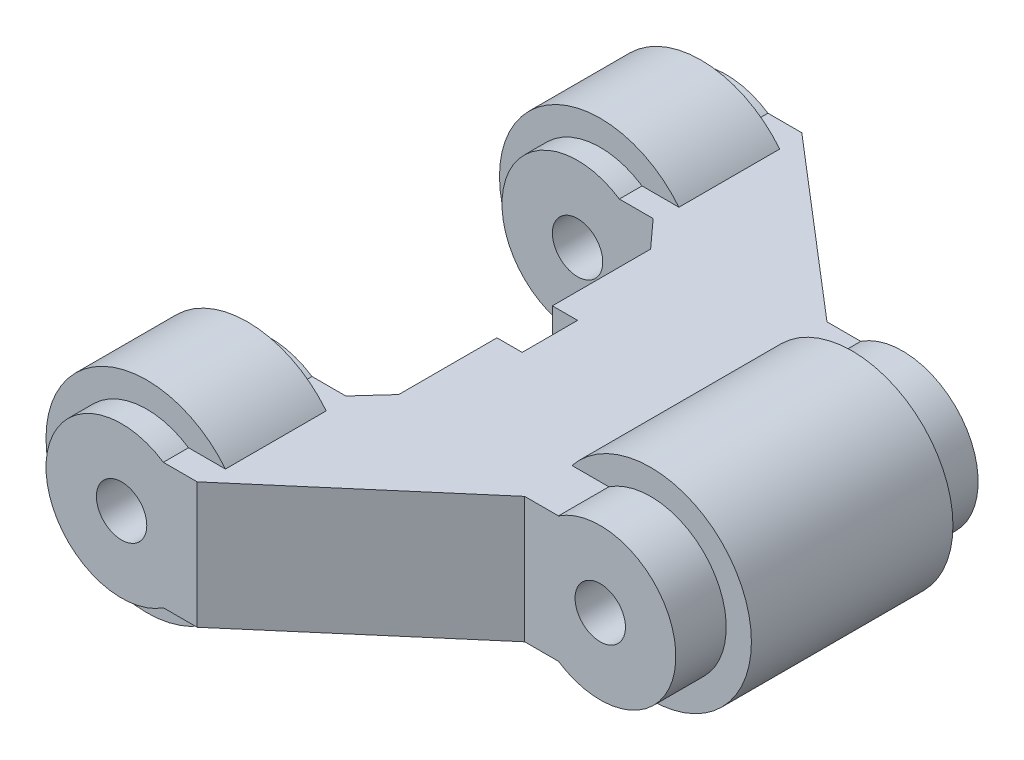
ISO-10303-21;
HEADER;
FILE_DESCRIPTION(('STEP AP214'),'2;1');
FILE_NAME('part.step','',(''),(''),'','','');
FILE_SCHEMA(('AUTOMOTIVE_DESIGN { 1 0 10303 214 1 1 1 1 }'));
ENDSEC;
DATA;
#1=APPLICATION_CONTEXT('core data for automotive mechanical design processes');
#2=APPLICATION_PROTOCOL_DEFINITION('international standard','automotive_design',2000,#1);
#3=PRODUCT_CONTEXT('',#1,'mechanical');
#4=PRODUCT('Part','Part','',(#3));
#5=PRODUCT_RELATED_PRODUCT_CATEGORY('part','',(#4));
#6=PRODUCT_DEFINITION_FORMATION('','',#4);
#7=PRODUCT_DEFINITION_CONTEXT('part definition',#1,'design');
#8=PRODUCT_DEFINITION('design','',#6,#7);
#9=PRODUCT_DEFINITION_SHAPE('','',#8);
#10=(LENGTH_UNIT() NAMED_UNIT(*) SI_UNIT(.MILLI.,.METRE.));
#11=(NAMED_UNIT(*) PLANE_ANGLE_UNIT() SI_UNIT($,.RADIAN.));
#12=(NAMED_UNIT(*) SI_UNIT($,.STERADIAN.) SOLID_ANGLE_UNIT());
#13=UNCERTAINTY_MEASURE_WITH_UNIT(LENGTH_MEASURE(1.E-05),#10,'distance_accuracy_value','');
#14=(GEOMETRIC_REPRESENTATION_CONTEXT(3) GLOBAL_UNCERTAINTY_ASSIGNED_CONTEXT((#13)) GLOBAL_UNIT_ASSIGNED_CONTEXT((#10,
#11,#12)) REPRESENTATION_CONTEXT('',''));
#15=CARTESIAN_POINT('',(0.,0.,0.));
#16=DIRECTION('',(0.,0.,1.));
#17=DIRECTION('',(1.,0.,0.));
#18=AXIS2_PLACEMENT_3D('',#15,#16,#17);
#19=CARTESIAN_POINT('',(0.,2.5,0.));
#20=DIRECTION('',(0.,1.,0.));
#21=DIRECTION('',(0.,0.,1.));
#22=AXIS2_PLACEMENT_3D('',#19,#20,#21);
#23=PLANE('',#22);
#24=DIRECTION('',(0.,0.,1.));
#25=VECTOR('',#24,1.);
#26=CARTESIAN_POINT('',(-2.5,2.5,0.));
#27=LINE('',#26,#25);
#28=CARTESIAN_POINT('',(-2.5,2.5,-5.));
#29=VERTEX_POINT('',#28);
#30=CARTESIAN_POINT('',(-2.5,2.5,-1.1));
#31=VERTEX_POINT('',#30);
#32=EDGE_CURVE('E245',#29,#31,#27,.T.);
#33=ORIENTED_EDGE('',*,*,#32,.T.);
#34=DIRECTION('',(1.,0.,0.));
#35=VECTOR('',#34,1.);
#36=CARTESIAN_POINT('',(0.,2.5,-1.1));
#37=LINE('',#36,#35);
#38=CARTESIAN_POINT('',(-1.5,2.5,-1.1));
#39=VERTEX_POINT('',#38);
#40=EDGE_CURVE('E239',#31,#39,#37,.T.);
#41=ORIENTED_EDGE('',*,*,#40,.T.);
#42=DIRECTION('',(0.,0.,1.));
#43=VECTOR('',#42,1.);
#44=CARTESIAN_POINT('',(-1.5,2.5,-1.1));
#45=LINE('',#44,#43);
#46=CARTESIAN_POINT('',(-1.5,2.5,1.1));
#47=VERTEX_POINT('',#46);
#48=EDGE_CURVE('E227',#39,#47,#45,.T.);
#49=ORIENTED_EDGE('',*,*,#48,.T.);
#50=DIRECTION('',(1.,0.,0.));
#51=VECTOR('',#50,1.);
#52=CARTESIAN_POINT('',(0.,2.5,1.1));
#53=LINE('',#52,#51);
#54=CARTESIAN_POINT('',(-2.5,2.5,1.1));
#55=VERTEX_POINT('',#54);
#56=EDGE_CURVE('E250',#55,#47,#53,.T.);
#57=ORIENTED_EDGE('',*,*,#56,.F.);
#58=CARTESIAN_POINT('',(-2.5,2.5,5.));
#59=VERTEX_POINT('',#58);
#60=EDGE_CURVE('E340',#55,#59,#27,.T.);
#61=ORIENTED_EDGE('',*,*,#60,.T.);
#62=DIRECTION('',(-0.672672793996312,0.,0.739940073395944));
#63=VECTOR('',#62,1.);
#64=CARTESIAN_POINT('',(1.11990950226244,2.5,1.01809954751131));
#65=LINE('',#64,#63);
#66=CARTESIAN_POINT('',(-3.5,2.5,6.1));
#67=VERTEX_POINT('',#66);
#68=EDGE_CURVE('E342',#59,#67,#65,.T.);
#69=ORIENTED_EDGE('',*,*,#68,.T.);
#70=DIRECTION('',(-1.,0.,0.));
#71=VECTOR('',#70,1.);
#72=CARTESIAN_POINT('',(0.,2.5,6.1));
#73=LINE('',#72,#71);
#74=CARTESIAN_POINT('',(-4.8416876048223,2.5,6.1));
#75=VERTEX_POINT('',#74);
#76=EDGE_CURVE('E344',#67,#75,#73,.T.);
#77=ORIENTED_EDGE('',*,*,#76,.T.);
#78=DIRECTION('',(0.,0.,-1.));
#79=VECTOR('',#78,1.);
#80=CARTESIAN_POINT('',(-4.8416876048223,2.5,12.));
#81=LINE('',#80,#79);
#82=CARTESIAN_POINT('',(-4.8416876048223,2.5,7.));
#83=VERTEX_POINT('',#82);
#84=EDGE_CURVE('E59',#75,#83,#81,.F.);
#85=ORIENTED_EDGE('',*,*,#84,.T.);
#86=DIRECTION('',(1.,0.,0.));
#87=VECTOR('',#86,1.);
#88=CARTESIAN_POINT('',(0.,2.5,7.));
#89=LINE('',#88,#87);
#90=CARTESIAN_POINT('',(-3.3775010008008,2.5,7.));
#91=VERTEX_POINT('',#90);
#92=EDGE_CURVE('E290',#83,#91,#89,.T.);
#93=ORIENTED_EDGE('',*,*,#92,.T.);
#94=DIRECTION('',(0.,0.,-1.));
#95=VECTOR('',#94,1.);
#96=CARTESIAN_POINT('',(-3.3775010008008,2.5,11.));
#97=LINE('',#96,#95);
#98=CARTESIAN_POINT('',(-3.3775010008008,2.5,11.));
#99=VERTEX_POINT('',#98);
#100=EDGE_CURVE('E292',#91,#99,#97,.F.);
#101=ORIENTED_EDGE('',*,*,#100,.T.);
#102=DIRECTION('',(1.,0.,0.));
#103=VECTOR('',#102,1.);
#104=CARTESIAN_POINT('',(0.,2.5,11.));
#105=LINE('',#104,#103);
#106=CARTESIAN_POINT('',(-4.8416876048223,2.5,11.));
#107=VERTEX_POINT('',#106);
#108=EDGE_CURVE('E287',#107,#99,#105,.T.);
#109=ORIENTED_EDGE('',*,*,#108,.F.);
#110=DIRECTION('',(0.,0.,-1.));
#111=VECTOR('',#110,1.);
#112=CARTESIAN_POINT('',(-4.8416876048223,2.5,12.));
#113=LINE('',#112,#111);
#114=CARTESIAN_POINT('',(-4.8416876048223,2.5,12.));
#115=VERTEX_POINT('',#114);
#116=EDGE_CURVE('E281',#107,#115,#113,.F.);
#117=ORIENTED_EDGE('',*,*,#116,.T.);
#118=DIRECTION('',(1.,0.,0.));
#119=VECTOR('',#118,1.);
#120=CARTESIAN_POINT('',(0.,2.5,12.));
#121=LINE('',#120,#119);
#122=CARTESIAN_POINT('',(-3.5,2.5,12.));
#123=VERTEX_POINT('',#122);
#124=EDGE_CURVE('E346',#115,#123,#121,.T.);
#125=ORIENTED_EDGE('',*,*,#124,.T.);
#126=DIRECTION('',(0.759256602365297,0.,-0.650791373455968));
#127=VECTOR('',#126,1.);
#128=CARTESIAN_POINT('',(4.44705882352941,2.5,5.18823529411765));
#129=LINE('',#128,#127);
#130=CARTESIAN_POINT('',(3.50000000000001,2.5,6.));
#131=VERTEX_POINT('',#130);
#132=EDGE_CURVE('E348',#123,#131,#129,.T.);
#133=ORIENTED_EDGE('',*,*,#132,.T.);
#134=DIRECTION('',(1.,0.,0.));
#135=VECTOR('',#134,1.);
#136=CARTESIAN_POINT('',(0.,2.5,6.));
#137=LINE('',#136,#135);
#138=CARTESIAN_POINT('',(4.8416876048223,2.5,6.));
#139=VERTEX_POINT('',#138);
#140=EDGE_CURVE('E350',#131,#139,#137,.T.);
#141=ORIENTED_EDGE('',*,*,#140,.T.);
#142=DIRECTION('',(0.,0.,-1.));
#143=VECTOR('',#142,1.);
#144=CARTESIAN_POINT('',(4.8416876048223,2.5,6.));
#145=LINE('',#144,#143);
#146=CARTESIAN_POINT('',(4.8416876048223,2.5,4.));
#147=VERTEX_POINT('',#146);
#148=EDGE_CURVE('E427',#147,#139,#145,.F.);
#149=ORIENTED_EDGE('',*,*,#148,.F.);
#150=DIRECTION('',(-1.,0.,0.));
#151=VECTOR('',#150,1.);
#152=CARTESIAN_POINT('',(0.,2.5,4.));
#153=LINE('',#152,#151);
#154=CARTESIAN_POINT('',(3.3775010008008,2.5,4.));
#155=VERTEX_POINT('',#154);
#156=EDGE_CURVE('E424',#147,#155,#153,.T.);
#157=ORIENTED_EDGE('',*,*,#156,.T.);
#158=DIRECTION('',(0.,0.,-1.));
#159=VECTOR('',#158,1.);
#160=CARTESIAN_POINT('',(3.3775010008008,2.5,4.));
#161=LINE('',#160,#159);
#162=CARTESIAN_POINT('',(3.3775010008008,2.5,-4.));
#163=VERTEX_POINT('',#162);
#164=EDGE_CURVE('E420',#163,#155,#161,.F.);
#165=ORIENTED_EDGE('',*,*,#164,.F.);
#166=DIRECTION('',(-1.,0.,0.));
#167=VECTOR('',#166,1.);
#168=CARTESIAN_POINT('',(0.,2.5,-4.));
#169=LINE('',#168,#167);
#170=CARTESIAN_POINT('',(4.8416876048223,2.5,-4.));
#171=VERTEX_POINT('',#170);
#172=EDGE_CURVE('E455',#171,#163,#169,.T.);
#173=ORIENTED_EDGE('',*,*,#172,.F.);
#174=DIRECTION('',(0.,0.,-1.));
#175=VECTOR('',#174,1.);
#176=CARTESIAN_POINT('',(4.8416876048223,2.5,6.));
#177=LINE('',#176,#175);
#178=CARTESIAN_POINT('',(4.8416876048223,2.5,-6.));
#179=VERTEX_POINT('',#178);
#180=EDGE_CURVE('E422',#179,#171,#177,.F.);
#181=ORIENTED_EDGE('',*,*,#180,.F.);
#182=DIRECTION('',(-1.,0.,0.));
#183=VECTOR('',#182,1.);
#184=CARTESIAN_POINT('',(0.,2.5,-6.));
#185=LINE('',#184,#183);
#186=CARTESIAN_POINT('',(3.5,2.5,-6.));
#187=VERTEX_POINT('',#186);
#188=EDGE_CURVE('E353',#179,#187,#185,.T.);
#189=ORIENTED_EDGE('',*,*,#188,.T.);
#190=DIRECTION('',(0.759256602365297,0.,0.650791373455968));
#191=VECTOR('',#190,1.);
#192=CARTESIAN_POINT('',(4.44705882352941,2.5,-5.18823529411765));
#193=LINE('',#192,#191);
#194=CARTESIAN_POINT('',(-3.5,2.5,-12.));
#195=VERTEX_POINT('',#194);
#196=EDGE_CURVE('E355',#195,#187,#193,.T.);
#197=ORIENTED_EDGE('',*,*,#196,.F.);
#198=DIRECTION('',(1.,0.,0.));
#199=VECTOR('',#198,1.);
#200=CARTESIAN_POINT('',(0.,2.5,-12.));
#201=LINE('',#200,#199);
#202=CARTESIAN_POINT('',(-4.8416876048223,2.5,-12.));
#203=VERTEX_POINT('',#202);
#204=EDGE_CURVE('E358',#203,#195,#201,.T.);
#205=ORIENTED_EDGE('',*,*,#204,.F.);
#206=DIRECTION('',(0.,0.,-1.));
#207=VECTOR('',#206,1.);
#208=CARTESIAN_POINT('',(-4.8416876048223,2.5,12.));
#209=LINE('',#208,#207);
#210=CARTESIAN_POINT('',(-4.8416876048223,2.5,-11.));
#211=VERTEX_POINT('',#210);
#212=EDGE_CURVE('E318',#203,#211,#209,.F.);
#213=ORIENTED_EDGE('',*,*,#212,.T.);
#214=DIRECTION('',(-1.,0.,0.));
#215=VECTOR('',#214,1.);
#216=CARTESIAN_POINT('',(0.,2.5,-11.));
#217=LINE('',#216,#215);
#218=CARTESIAN_POINT('',(-3.3775010008008,2.5,-11.));
#219=VERTEX_POINT('',#218);
#220=EDGE_CURVE('E329',#219,#211,#217,.T.);
#221=ORIENTED_EDGE('',*,*,#220,.F.);
#222=DIRECTION('',(0.,0.,1.));
#223=VECTOR('',#222,1.);
#224=CARTESIAN_POINT('',(-3.3775010008008,2.5,-11.));
#225=LINE('',#224,#223);
#226=CARTESIAN_POINT('',(-3.3775010008008,2.5,-7.));
#227=VERTEX_POINT('',#226);
#228=EDGE_CURVE('E331',#227,#219,#225,.F.);
#229=ORIENTED_EDGE('',*,*,#228,.F.);
#230=DIRECTION('',(-1.,0.,0.));
#231=VECTOR('',#230,1.);
#232=CARTESIAN_POINT('',(0.,2.5,-7.));
#233=LINE('',#232,#231);
#234=CARTESIAN_POINT('',(-4.8416876048223,2.5,-7.));
#235=VERTEX_POINT('',#234);
#236=EDGE_CURVE('E326',#227,#235,#233,.T.);
#237=ORIENTED_EDGE('',*,*,#236,.T.);
#238=DIRECTION('',(0.,0.,-1.));
#239=VECTOR('',#238,1.);
#240=CARTESIAN_POINT('',(-4.8416876048223,2.5,12.));
#241=LINE('',#240,#239);
#242=CARTESIAN_POINT('',(-4.8416876048223,2.5,-6.1));
#243=VERTEX_POINT('',#242);
#244=EDGE_CURVE('E323',#235,#243,#241,.F.);
#245=ORIENTED_EDGE('',*,*,#244,.T.);
#246=DIRECTION('',(-1.,0.,0.));
#247=VECTOR('',#246,1.);
#248=CARTESIAN_POINT('',(0.,2.5,-6.1));
#249=LINE('',#248,#247);
#250=CARTESIAN_POINT('',(-3.5,2.5,-6.1));
#251=VERTEX_POINT('',#250);
#252=EDGE_CURVE('E334',#251,#243,#249,.T.);
#253=ORIENTED_EDGE('',*,*,#252,.F.);
#254=DIRECTION('',(0.672672793996313,0.,0.739940073395944));
#255=VECTOR('',#254,1.);
#256=CARTESIAN_POINT('',(1.11990950226244,2.5,-1.01809954751131));
#257=LINE('',#256,#255);
#258=EDGE_CURVE('E337',#251,#29,#257,.T.);
#259=ORIENTED_EDGE('',*,*,#258,.T.);
#260=EDGE_LOOP('',(#33,#41,#49,#57,#61,#69,#77,#85,#93,#101,#109,#117,#125,#133,#141,#149,#157,
#165,#173,#181,#189,#197,#205,#213,#221,#229,#237,#245,#253,#259));
#261=FACE_BOUND('',#260,.T.);
#262=ADVANCED_FACE('F36',(#261),#23,.T.);
#263=CARTESIAN_POINT('',(-2.5,2.5,0.));
#264=DIRECTION('',(1.,0.,0.));
#265=DIRECTION('',(0.,0.,-1.));
#266=AXIS2_PLACEMENT_3D('',#263,#264,#265);
#267=PLANE('',#266);
#268=DIRECTION('',(0.,1.,0.));
#269=VECTOR('',#268,1.);
#270=CARTESIAN_POINT('',(-2.5,0.,-1.1));
#271=LINE('',#270,#269);
#272=CARTESIAN_POINT('',(-2.5,-2.5,-1.1));
#273=VERTEX_POINT('',#272);
#274=EDGE_CURVE('E235',#273,#31,#271,.T.);
#275=ORIENTED_EDGE('',*,*,#274,.T.);
#276=ORIENTED_EDGE('',*,*,#32,.F.);
#277=DIRECTION('',(0.,-1.,0.));
#278=VECTOR('',#277,1.);
#279=CARTESIAN_POINT('',(-2.5,2.5,-5.));
#280=LINE('',#279,#278);
#281=CARTESIAN_POINT('',(-2.5,-2.5,-5.));
#282=VERTEX_POINT('',#281);
#283=EDGE_CURVE('E404',#29,#282,#280,.T.);
#284=ORIENTED_EDGE('',*,*,#283,.T.);
#285=DIRECTION('',(0.,0.,1.));
#286=VECTOR('',#285,1.);
#287=CARTESIAN_POINT('',(-2.5,-2.5,0.));
#288=LINE('',#287,#286);
#289=EDGE_CURVE('E366',#282,#273,#288,.T.);
#290=ORIENTED_EDGE('',*,*,#289,.T.);
#291=EDGE_LOOP('',(#275,#276,#284,#290));
#292=FACE_BOUND('',#291,.T.);
#293=ADVANCED_FACE('F564',(#292),#267,.F.);
#294=CARTESIAN_POINT('',(0.,-2.5,0.));
#295=DIRECTION('',(0.,1.,0.));
#296=DIRECTION('',(0.,0.,1.));
#297=AXIS2_PLACEMENT_3D('',#294,#295,#296);
#298=PLANE('',#297);
#299=DIRECTION('',(0.,0.,-1.));
#300=VECTOR('',#299,1.);
#301=CARTESIAN_POINT('',(-4.8416876048223,-2.5,12.));
#302=LINE('',#301,#300);
#303=CARTESIAN_POINT('',(-4.8416876048223,-2.5,6.1));
#304=VERTEX_POINT('',#303);
#305=CARTESIAN_POINT('',(-4.8416876048223,-2.5,7.));
#306=VERTEX_POINT('',#305);
#307=EDGE_CURVE('E283',#304,#306,#302,.F.);
#308=ORIENTED_EDGE('',*,*,#307,.F.);
#309=DIRECTION('',(-1.,0.,0.));
#310=VECTOR('',#309,1.);
#311=CARTESIAN_POINT('',(0.,-2.5,6.1));
#312=LINE('',#311,#310);
#313=CARTESIAN_POINT('',(-3.5,-2.5,6.1));
#314=VERTEX_POINT('',#313);
#315=EDGE_CURVE('E372',#314,#304,#312,.T.);
#316=ORIENTED_EDGE('',*,*,#315,.F.);
#317=DIRECTION('',(-0.672672793996312,0.,0.739940073395944));
#318=VECTOR('',#317,1.);
#319=CARTESIAN_POINT('',(1.11990950226244,-2.5,1.01809954751131));
#320=LINE('',#319,#318);
#321=CARTESIAN_POINT('',(-2.5,-2.5,5.));
#322=VERTEX_POINT('',#321);
#323=EDGE_CURVE('E369',#322,#314,#320,.T.);
#324=ORIENTED_EDGE('',*,*,#323,.F.);
#325=CARTESIAN_POINT('',(-2.5,-2.5,1.1));
#326=VERTEX_POINT('',#325);
#327=EDGE_CURVE('E365',#326,#322,#288,.T.);
#328=ORIENTED_EDGE('',*,*,#327,.F.);
#329=DIRECTION('',(0.,0.,1.));
#330=VECTOR('',#329,1.);
#331=CARTESIAN_POINT('',(-2.5,-2.5,-1.1));
#332=LINE('',#331,#330);
#333=EDGE_CURVE('E234',#273,#326,#332,.T.);
#334=ORIENTED_EDGE('',*,*,#333,.F.);
#335=ORIENTED_EDGE('',*,*,#289,.F.);
#336=DIRECTION('',(0.672672793996313,0.,0.739940073395944));
#337=VECTOR('',#336,1.);
#338=CARTESIAN_POINT('',(1.11990950226244,-2.5,-1.01809954751131));
#339=LINE('',#338,#337);
#340=CARTESIAN_POINT('',(-3.5,-2.5,-6.1));
#341=VERTEX_POINT('',#340);
#342=EDGE_CURVE('E363',#341,#282,#339,.T.);
#343=ORIENTED_EDGE('',*,*,#342,.F.);
#344=DIRECTION('',(-1.,0.,0.));
#345=VECTOR('',#344,1.);
#346=CARTESIAN_POINT('',(0.,-2.5,-6.1));
#347=LINE('',#346,#345);
#348=CARTESIAN_POINT('',(-4.8416876048223,-2.5,-6.1));
#349=VERTEX_POINT('',#348);
#350=EDGE_CURVE('E333',#341,#349,#347,.T.);
#351=ORIENTED_EDGE('',*,*,#350,.T.);
#352=DIRECTION('',(0.,0.,-1.));
#353=VECTOR('',#352,1.);
#354=CARTESIAN_POINT('',(-4.8416876048223,-2.5,12.));
#355=LINE('',#354,#353);
#356=CARTESIAN_POINT('',(-4.8416876048223,-2.5,-7.));
#357=VERTEX_POINT('',#356);
#358=EDGE_CURVE('E321',#357,#349,#355,.F.);
#359=ORIENTED_EDGE('',*,*,#358,.F.);
#360=DIRECTION('',(-1.,0.,0.));
#361=VECTOR('',#360,1.);
#362=CARTESIAN_POINT('',(0.,-2.5,-7.));
#363=LINE('',#362,#361);
#364=CARTESIAN_POINT('',(-3.3775010008008,-2.5,-7.));
#365=VERTEX_POINT('',#364);
#366=EDGE_CURVE('E457',#365,#357,#363,.T.);
#367=ORIENTED_EDGE('',*,*,#366,.F.);
#368=DIRECTION('',(0.,0.,1.));
#369=VECTOR('',#368,1.);
#370=CARTESIAN_POINT('',(-3.3775010008008,-2.5,-11.));
#371=LINE('',#370,#369);
#372=CARTESIAN_POINT('',(-3.3775010008008,-2.5,-11.));
#373=VERTEX_POINT('',#372);
#374=EDGE_CURVE('E459',#365,#373,#371,.F.);
#375=ORIENTED_EDGE('',*,*,#374,.T.);
#376=DIRECTION('',(-1.,0.,0.));
#377=VECTOR('',#376,1.);
#378=CARTESIAN_POINT('',(0.,-2.5,-11.));
#379=LINE('',#378,#377);
#380=CARTESIAN_POINT('',(-4.8416876048223,-2.5,-11.));
#381=VERTEX_POINT('',#380);
#382=EDGE_CURVE('E462',#373,#381,#379,.T.);
#383=ORIENTED_EDGE('',*,*,#382,.T.);
#384=DIRECTION('',(0.,0.,-1.));
#385=VECTOR('',#384,1.);
#386=CARTESIAN_POINT('',(-4.8416876048223,-2.5,12.));
#387=LINE('',#386,#385);
#388=CARTESIAN_POINT('',(-4.8416876048223,-2.5,-12.));
#389=VERTEX_POINT('',#388);
#390=EDGE_CURVE('E298',#389,#381,#387,.F.);
#391=ORIENTED_EDGE('',*,*,#390,.F.);
#392=DIRECTION('',(1.,0.,0.));
#393=VECTOR('',#392,1.);
#394=CARTESIAN_POINT('',(0.,-2.5,-12.));
#395=LINE('',#394,#393);
#396=CARTESIAN_POINT('',(-3.5,-2.5,-12.));
#397=VERTEX_POINT('',#396);
#398=EDGE_CURVE('E338',#389,#397,#395,.T.);
#399=ORIENTED_EDGE('',*,*,#398,.T.);
#400=DIRECTION('',(0.759256602365297,0.,0.650791373455968));
#401=VECTOR('',#400,1.);
#402=CARTESIAN_POINT('',(4.44705882352941,-2.5,-5.18823529411765));
#403=LINE('',#402,#401);
#404=CARTESIAN_POINT('',(3.5,-2.5,-6.));
#405=VERTEX_POINT('',#404);
#406=EDGE_CURVE('E387',#397,#405,#403,.T.);
#407=ORIENTED_EDGE('',*,*,#406,.T.);
#408=DIRECTION('',(-1.,0.,0.));
#409=VECTOR('',#408,1.);
#410=CARTESIAN_POINT('',(0.,-2.5,-6.));
#411=LINE('',#410,#409);
#412=CARTESIAN_POINT('',(4.8416876048223,-2.5,-6.));
#413=VERTEX_POINT('',#412);
#414=EDGE_CURVE('E384',#413,#405,#411,.T.);
#415=ORIENTED_EDGE('',*,*,#414,.F.);
#416=DIRECTION('',(0.,0.,-1.));
#417=VECTOR('',#416,1.);
#418=CARTESIAN_POINT('',(4.8416876048223,-2.5,6.));
#419=LINE('',#418,#417);
#420=CARTESIAN_POINT('',(4.8416876048223,-2.5,-4.));
#421=VERTEX_POINT('',#420);
#422=EDGE_CURVE('E412',#413,#421,#419,.F.);
#423=ORIENTED_EDGE('',*,*,#422,.T.);
#424=DIRECTION('',(-1.,0.,0.));
#425=VECTOR('',#424,1.);
#426=CARTESIAN_POINT('',(0.,-2.5,-4.));
#427=LINE('',#426,#425);
#428=CARTESIAN_POINT('',(3.3775010008008,-2.5,-4.));
#429=VERTEX_POINT('',#428);
#430=EDGE_CURVE('E452',#421,#429,#427,.T.);
#431=ORIENTED_EDGE('',*,*,#430,.T.);
#432=DIRECTION('',(0.,0.,-1.));
#433=VECTOR('',#432,1.);
#434=CARTESIAN_POINT('',(3.3775010008008,-2.5,4.));
#435=LINE('',#434,#433);
#436=CARTESIAN_POINT('',(3.3775010008008,-2.5,4.));
#437=VERTEX_POINT('',#436);
#438=EDGE_CURVE('E409',#429,#437,#435,.F.);
#439=ORIENTED_EDGE('',*,*,#438,.T.);
#440=DIRECTION('',(-1.,0.,0.));
#441=VECTOR('',#440,1.);
#442=CARTESIAN_POINT('',(0.,-2.5,4.));
#443=LINE('',#442,#441);
#444=CARTESIAN_POINT('',(4.8416876048223,-2.5,4.));
#445=VERTEX_POINT('',#444);
#446=EDGE_CURVE('E415',#445,#437,#443,.T.);
#447=ORIENTED_EDGE('',*,*,#446,.F.);
#448=DIRECTION('',(0.,0.,-1.));
#449=VECTOR('',#448,1.);
#450=CARTESIAN_POINT('',(4.8416876048223,-2.5,6.));
#451=LINE('',#450,#449);
#452=CARTESIAN_POINT('',(4.8416876048223,-2.5,6.));
#453=VERTEX_POINT('',#452);
#454=EDGE_CURVE('E417',#445,#453,#451,.F.);
#455=ORIENTED_EDGE('',*,*,#454,.T.);
#456=DIRECTION('',(1.,0.,0.));
#457=VECTOR('',#456,1.);
#458=CARTESIAN_POINT('',(0.,-2.5,6.));
#459=LINE('',#458,#457);
#460=CARTESIAN_POINT('',(3.50000000000001,-2.5,6.));
#461=VERTEX_POINT('',#460);
#462=EDGE_CURVE('E381',#461,#453,#459,.T.);
#463=ORIENTED_EDGE('',*,*,#462,.F.);
#464=DIRECTION('',(0.759256602365297,0.,-0.650791373455968));
#465=VECTOR('',#464,1.);
#466=CARTESIAN_POINT('',(4.44705882352941,-2.5,5.18823529411765));
#467=LINE('',#466,#465);
#468=CARTESIAN_POINT('',(-3.5,-2.5,12.));
#469=VERTEX_POINT('',#468);
#470=EDGE_CURVE('E378',#469,#461,#467,.T.);
#471=ORIENTED_EDGE('',*,*,#470,.F.);
#472=DIRECTION('',(1.,0.,0.));
#473=VECTOR('',#472,1.);
#474=CARTESIAN_POINT('',(0.,-2.5,12.));
#475=LINE('',#474,#473);
#476=CARTESIAN_POINT('',(-4.8416876048223,-2.5,12.));
#477=VERTEX_POINT('',#476);
#478=EDGE_CURVE('E375',#477,#469,#475,.T.);
#479=ORIENTED_EDGE('',*,*,#478,.F.);
#480=DIRECTION('',(0.,0.,-1.));
#481=VECTOR('',#480,1.);
#482=CARTESIAN_POINT('',(-4.8416876048223,-2.5,12.));
#483=LINE('',#482,#481);
#484=CARTESIAN_POINT('',(-4.8416876048223,-2.5,11.));
#485=VERTEX_POINT('',#484);
#486=EDGE_CURVE('E276',#485,#477,#483,.F.);
#487=ORIENTED_EDGE('',*,*,#486,.F.);
#488=DIRECTION('',(1.,0.,0.));
#489=VECTOR('',#488,1.);
#490=CARTESIAN_POINT('',(0.,-2.5,11.));
#491=LINE('',#490,#489);
#492=CARTESIAN_POINT('',(-3.3775010008008,-2.5,11.));
#493=VERTEX_POINT('',#492);
#494=EDGE_CURVE('E465',#485,#493,#491,.T.);
#495=ORIENTED_EDGE('',*,*,#494,.T.);
#496=DIRECTION('',(0.,0.,-1.));
#497=VECTOR('',#496,1.);
#498=CARTESIAN_POINT('',(-3.3775010008008,-2.5,11.));
#499=LINE('',#498,#497);
#500=CARTESIAN_POINT('',(-3.3775010008008,-2.5,7.));
#501=VERTEX_POINT('',#500);
#502=EDGE_CURVE('E44',#501,#493,#499,.F.);
#503=ORIENTED_EDGE('',*,*,#502,.F.);
#504=DIRECTION('',(1.,0.,0.));
#505=VECTOR('',#504,1.);
#506=CARTESIAN_POINT('',(0.,-2.5,7.));
#507=LINE('',#506,#505);
#508=EDGE_CURVE('E11',#306,#501,#507,.T.);
#509=ORIENTED_EDGE('',*,*,#508,.F.);
#510=EDGE_LOOP('',(#308,#316,#324,#328,#334,#335,#343,#351,#359,#367,#375,#383,#391,#399,#407,
#415,#423,#431,#439,#447,#455,#463,#471,#479,#487,#495,#503,#509));
#511=FACE_BOUND('',#510,.T.);
#512=ADVANCED_FACE('F500',(#511),#298,.F.);
#513=CARTESIAN_POINT('',(6.5,0.,6.));
#514=DIRECTION('',(0.,0.,-1.));
#515=DIRECTION('',(-1.,0.,0.));
#516=AXIS2_PLACEMENT_3D('',#513,#514,#515);
#517=CYLINDRICAL_SURFACE('',#516,3.);
#518=CARTESIAN_POINT('',(6.5,0.,-6.));
#519=DIRECTION('',(0.,0.,1.));
#520=DIRECTION('',(1.,0.,0.));
#521=AXIS2_PLACEMENT_3D('',#518,#519,#520);
#522=CIRCLE('',#521,3.);
#523=EDGE_CURVE('E443',#413,#179,#522,.T.);
#524=ORIENTED_EDGE('',*,*,#523,.T.);
#525=ORIENTED_EDGE('',*,*,#180,.T.);
#526=CARTESIAN_POINT('',(6.5,0.,-4.));
#527=DIRECTION('',(0.,0.,1.));
#528=DIRECTION('',(1.,0.,0.));
#529=AXIS2_PLACEMENT_3D('',#526,#527,#528);
#530=CIRCLE('',#529,3.);
#531=EDGE_CURVE('E446',#421,#171,#530,.T.);
#532=ORIENTED_EDGE('',*,*,#531,.F.);
#533=ORIENTED_EDGE('',*,*,#422,.F.);
#534=EDGE_LOOP('',(#524,#525,#532,#533));
#535=FACE_BOUND('',#534,.T.);
#536=ADVANCED_FACE('F515',(#535),#517,.T.);
#537=CARTESIAN_POINT('',(6.5,0.,6.));
#538=DIRECTION('',(0.,0.,-1.));
#539=DIRECTION('',(-1.,0.,0.));
#540=AXIS2_PLACEMENT_3D('',#537,#538,#539);
#541=CYLINDRICAL_SURFACE('',#540,1.);
#542=CARTESIAN_POINT('',(6.5,0.,-6.));
#543=DIRECTION('',(0.,0.,1.));
#544=DIRECTION('',(1.,0.,0.));
#545=AXIS2_PLACEMENT_3D('',#542,#543,#544);
#546=CIRCLE('',#545,1.);
#547=CARTESIAN_POINT('',(7.5,0.,-6.));
#548=VERTEX_POINT('',#547);
#549=EDGE_CURVE('E436',#548,#548,#546,.T.);
#550=ORIENTED_EDGE('',*,*,#549,.F.);
#551=EDGE_LOOP('',(#550));
#552=FACE_BOUND('',#551,.T.);
#553=CARTESIAN_POINT('',(6.5,0.,6.));
#554=DIRECTION('',(0.,0.,1.));
#555=DIRECTION('',(1.,0.,0.));
#556=AXIS2_PLACEMENT_3D('',#553,#554,#555);
#557=CIRCLE('',#556,1.);
#558=CARTESIAN_POINT('',(7.5,0.,6.));
#559=VERTEX_POINT('',#558);
#560=EDGE_CURVE('E439',#559,#559,#557,.T.);
#561=ORIENTED_EDGE('',*,*,#560,.T.);
#562=EDGE_LOOP('',(#561));
#563=FACE_BOUND('',#562,.T.);
#564=ADVANCED_FACE('F38',(#552,#563),#541,.F.);
#565=CARTESIAN_POINT('',(6.5,0.,4.));
#566=DIRECTION('',(0.,0.,1.));
#567=DIRECTION('',(1.,0.,0.));
#568=AXIS2_PLACEMENT_3D('',#565,#566,#567);
#569=CIRCLE('',#568,3.);
#570=EDGE_CURVE('E430',#445,#147,#569,.T.);
#571=ORIENTED_EDGE('',*,*,#570,.T.);
#572=ORIENTED_EDGE('',*,*,#148,.T.);
#573=CARTESIAN_POINT('',(6.5,0.,6.));
#574=DIRECTION('',(0.,0.,1.));
#575=DIRECTION('',(1.,0.,0.));
#576=AXIS2_PLACEMENT_3D('',#573,#574,#575);
#577=CIRCLE('',#576,3.);
#578=EDGE_CURVE('E442',#453,#139,#577,.T.);
#579=ORIENTED_EDGE('',*,*,#578,.F.);
#580=ORIENTED_EDGE('',*,*,#454,.F.);
#581=EDGE_LOOP('',(#571,#572,#579,#580));
#582=FACE_BOUND('',#581,.T.);
#583=ADVANCED_FACE('F497',(#582),#517,.T.);
#584=CARTESIAN_POINT('',(0.,0.,6.));
#585=DIRECTION('',(0.,0.,1.));
#586=DIRECTION('',(1.,0.,0.));
#587=AXIS2_PLACEMENT_3D('',#584,#585,#586);
#588=PLANE('',#587);
#589=ORIENTED_EDGE('',*,*,#560,.F.);
#590=EDGE_LOOP('',(#589));
#591=FACE_BOUND('',#590,.T.);
#592=ORIENTED_EDGE('',*,*,#578,.T.);
#593=ORIENTED_EDGE('',*,*,#140,.F.);
#594=DIRECTION('',(0.,-1.,0.));
#595=VECTOR('',#594,1.);
#596=CARTESIAN_POINT('',(3.50000000000001,2.5,6.));
#597=LINE('',#596,#595);
#598=EDGE_CURVE('E395',#131,#461,#597,.T.);
#599=ORIENTED_EDGE('',*,*,#598,.T.);
#600=ORIENTED_EDGE('',*,*,#462,.T.);
#601=EDGE_LOOP('',(#592,#593,#599,#600));
#602=FACE_BOUND('',#601,.T.);
#603=ADVANCED_FACE('F495',(#591,#602),#588,.T.);
#604=CARTESIAN_POINT('',(0.,0.,-6.));
#605=DIRECTION('',(0.,0.,1.));
#606=DIRECTION('',(1.,0.,0.));
#607=AXIS2_PLACEMENT_3D('',#604,#605,#606);
#608=PLANE('',#607);
#609=ORIENTED_EDGE('',*,*,#549,.T.);
#610=EDGE_LOOP('',(#609));
#611=FACE_BOUND('',#610,.T.);
#612=ORIENTED_EDGE('',*,*,#414,.T.);
#613=DIRECTION('',(0.,-1.,0.));
#614=VECTOR('',#613,1.);
#615=CARTESIAN_POINT('',(3.5,2.5,-6.));
#616=LINE('',#615,#614);
#617=EDGE_CURVE('E393',#187,#405,#616,.T.);
#618=ORIENTED_EDGE('',*,*,#617,.F.);
#619=ORIENTED_EDGE('',*,*,#188,.F.);
#620=ORIENTED_EDGE('',*,*,#523,.F.);
#621=EDGE_LOOP('',(#612,#618,#619,#620));
#622=FACE_BOUND('',#621,.T.);
#623=ADVANCED_FACE('F521',(#611,#622),#608,.F.);
#624=CARTESIAN_POINT('',(6.5,0.,4.));
#625=DIRECTION('',(0.,0.,-1.));
#626=DIRECTION('',(-1.,0.,0.));
#627=AXIS2_PLACEMENT_3D('',#624,#625,#626);
#628=CYLINDRICAL_SURFACE('',#627,4.);
#629=CARTESIAN_POINT('',(6.5,0.,-4.));
#630=DIRECTION('',(0.,0.,1.));
#631=DIRECTION('',(1.,0.,0.));
#632=AXIS2_PLACEMENT_3D('',#629,#630,#631);
#633=CIRCLE('',#632,4.);
#634=EDGE_CURVE('E429',#429,#163,#633,.T.);
#635=ORIENTED_EDGE('',*,*,#634,.T.);
#636=ORIENTED_EDGE('',*,*,#164,.T.);
#637=CARTESIAN_POINT('',(6.5,0.,4.));
#638=DIRECTION('',(0.,0.,1.));
#639=DIRECTION('',(1.,0.,0.));
#640=AXIS2_PLACEMENT_3D('',#637,#638,#639);
#641=CIRCLE('',#640,4.);
#642=EDGE_CURVE('E433',#437,#155,#641,.T.);
#643=ORIENTED_EDGE('',*,*,#642,.F.);
#644=ORIENTED_EDGE('',*,*,#438,.F.);
#645=EDGE_LOOP('',(#635,#636,#643,#644));
#646=FACE_BOUND('',#645,.T.);
#647=ADVANCED_FACE('F506',(#646),#628,.T.);
#648=CARTESIAN_POINT('',(0.,0.,4.));
#649=DIRECTION('',(0.,0.,1.));
#650=DIRECTION('',(1.,0.,0.));
#651=AXIS2_PLACEMENT_3D('',#648,#649,#650);
#652=PLANE('',#651);
#653=ORIENTED_EDGE('',*,*,#156,.F.);
#654=ORIENTED_EDGE('',*,*,#570,.F.);
#655=ORIENTED_EDGE('',*,*,#446,.T.);
#656=ORIENTED_EDGE('',*,*,#642,.T.);
#657=EDGE_LOOP('',(#653,#654,#655,#656));
#658=FACE_BOUND('',#657,.T.);
#659=ADVANCED_FACE('F504',(#658),#652,.T.);
#660=CARTESIAN_POINT('',(0.,0.,-4.));
#661=DIRECTION('',(0.,0.,1.));
#662=DIRECTION('',(1.,0.,0.));
#663=AXIS2_PLACEMENT_3D('',#660,#661,#662);
#664=PLANE('',#663);
#665=ORIENTED_EDGE('',*,*,#531,.T.);
#666=ORIENTED_EDGE('',*,*,#172,.T.);
#667=ORIENTED_EDGE('',*,*,#634,.F.);
#668=ORIENTED_EDGE('',*,*,#430,.F.);
#669=EDGE_LOOP('',(#665,#666,#667,#668));
#670=FACE_BOUND('',#669,.T.);
#671=ADVANCED_FACE('F512',(#670),#664,.F.);
#672=CARTESIAN_POINT('',(0.,2.5,-6.1));
#673=DIRECTION('',(0.,0.,1.));
#674=DIRECTION('',(1.,0.,0.));
#675=AXIS2_PLACEMENT_3D('',#672,#673,#674);
#676=PLANE('',#675);
#677=ORIENTED_EDGE('',*,*,#252,.T.);
#678=CARTESIAN_POINT('',(-6.5,0.,-6.1));
#679=DIRECTION('',(0.,0.,-1.));
#680=DIRECTION('',(-1.,0.,0.));
#681=AXIS2_PLACEMENT_3D('',#678,#679,#680);
#682=CIRCLE('',#681,3.);
#683=EDGE_CURVE('E294',#349,#243,#682,.T.);
#684=ORIENTED_EDGE('',*,*,#683,.F.);
#685=ORIENTED_EDGE('',*,*,#350,.F.);
#686=DIRECTION('',(0.,-1.,0.));
#687=VECTOR('',#686,1.);
#688=CARTESIAN_POINT('',(-3.5,2.5,-6.1));
#689=LINE('',#688,#687);
#690=EDGE_CURVE('E407',#251,#341,#689,.T.);
#691=ORIENTED_EDGE('',*,*,#690,.F.);
#692=EDGE_LOOP('',(#677,#684,#685,#691));
#693=FACE_BOUND('',#692,.T.);
#694=CARTESIAN_POINT('',(-6.5,0.,-6.1));
#695=DIRECTION('',(0.,0.,-1.));
#696=DIRECTION('',(-1.,0.,0.));
#697=AXIS2_PLACEMENT_3D('',#694,#695,#696);
#698=CIRCLE('',#697,1.);
#699=CARTESIAN_POINT('',(-7.5,0.,-6.1));
#700=VERTEX_POINT('',#699);
#701=EDGE_CURVE('E295',#700,#700,#698,.T.);
#702=ORIENTED_EDGE('',*,*,#701,.T.);
#703=EDGE_LOOP('',(#702));
#704=FACE_BOUND('',#703,.T.);
#705=ADVANCED_FACE('F555',(#693,#704),#676,.T.);
#706=CARTESIAN_POINT('',(1.11990950226244,2.5,-1.01809954751131));
#707=DIRECTION('',(0.739940073395944,0.,-0.672672793996313));
#708=DIRECTION('',(-0.672672793996313,0.,-0.739940073395944));
#709=AXIS2_PLACEMENT_3D('',#706,#707,#708);
#710=PLANE('',#709);
#711=ORIENTED_EDGE('',*,*,#342,.T.);
#712=ORIENTED_EDGE('',*,*,#283,.F.);
#713=ORIENTED_EDGE('',*,*,#258,.F.);
#714=ORIENTED_EDGE('',*,*,#690,.T.);
#715=EDGE_LOOP('',(#711,#712,#713,#714));
#716=FACE_BOUND('',#715,.T.);
#717=ADVANCED_FACE('F561',(#716),#710,.F.);
#718=ORIENTED_EDGE('',*,*,#60,.F.);
#719=DIRECTION('',(0.,1.,0.));
#720=VECTOR('',#719,1.);
#721=CARTESIAN_POINT('',(-2.5,0.,1.1));
#722=LINE('',#721,#720);
#723=EDGE_CURVE('E241',#326,#55,#722,.T.);
#724=ORIENTED_EDGE('',*,*,#723,.F.);
#725=ORIENTED_EDGE('',*,*,#327,.T.);
#726=DIRECTION('',(0.,-1.,0.));
#727=VECTOR('',#726,1.);
#728=CARTESIAN_POINT('',(-2.5,2.5,5.));
#729=LINE('',#728,#727);
#730=EDGE_CURVE('E401',#59,#322,#729,.T.);
#731=ORIENTED_EDGE('',*,*,#730,.F.);
#732=EDGE_LOOP('',(#718,#724,#725,#731));
#733=FACE_BOUND('',#732,.T.);
#734=ADVANCED_FACE('F570',(#733),#267,.F.);
#735=CARTESIAN_POINT('',(1.11990950226244,2.5,1.01809954751131));
#736=DIRECTION('',(0.739940073395944,0.,0.672672793996312));
#737=DIRECTION('',(0.672672793996312,0.,-0.739940073395944));
#738=AXIS2_PLACEMENT_3D('',#735,#736,#737);
#739=PLANE('',#738);
#740=ORIENTED_EDGE('',*,*,#323,.T.);
#741=DIRECTION('',(0.,-1.,0.));
#742=VECTOR('',#741,1.);
#743=CARTESIAN_POINT('',(-3.5,2.5,6.1));
#744=LINE('',#743,#742);
#745=EDGE_CURVE('E399',#67,#314,#744,.T.);
#746=ORIENTED_EDGE('',*,*,#745,.F.);
#747=ORIENTED_EDGE('',*,*,#68,.F.);
#748=ORIENTED_EDGE('',*,*,#730,.T.);
#749=EDGE_LOOP('',(#740,#746,#747,#748));
#750=FACE_BOUND('',#749,.T.);
#751=ADVANCED_FACE('F576',(#750),#739,.F.);
#752=CARTESIAN_POINT('',(0.,2.5,6.1));
#753=DIRECTION('',(0.,0.,1.));
#754=DIRECTION('',(1.,0.,0.));
#755=AXIS2_PLACEMENT_3D('',#752,#753,#754);
#756=PLANE('',#755);
#757=CARTESIAN_POINT('',(-6.5,0.,6.1));
#758=DIRECTION('',(0.,0.,1.));
#759=DIRECTION('',(1.,0.,0.));
#760=AXIS2_PLACEMENT_3D('',#757,#758,#759);
#761=CIRCLE('',#760,3.);
#762=EDGE_CURVE('E255',#75,#304,#761,.T.);
#763=ORIENTED_EDGE('',*,*,#762,.F.);
#764=ORIENTED_EDGE('',*,*,#76,.F.);
#765=ORIENTED_EDGE('',*,*,#745,.T.);
#766=ORIENTED_EDGE('',*,*,#315,.T.);
#767=EDGE_LOOP('',(#763,#764,#765,#766));
#768=FACE_BOUND('',#767,.T.);
#769=CARTESIAN_POINT('',(-6.5,0.,6.1));
#770=DIRECTION('',(0.,0.,1.));
#771=DIRECTION('',(1.,0.,0.));
#772=AXIS2_PLACEMENT_3D('',#769,#770,#771);
#773=CIRCLE('',#772,1.);
#774=CARTESIAN_POINT('',(-5.5,0.,6.1));
#775=VERTEX_POINT('',#774);
#776=EDGE_CURVE('E253',#775,#775,#773,.T.);
#777=ORIENTED_EDGE('',*,*,#776,.T.);
#778=EDGE_LOOP('',(#777));
#779=FACE_BOUND('',#778,.T.);
#780=ADVANCED_FACE('F581',(#768,#779),#756,.F.);
#781=CARTESIAN_POINT('',(0.,2.5,12.));
#782=DIRECTION('',(0.,0.,-1.));
#783=DIRECTION('',(-1.,0.,0.));
#784=AXIS2_PLACEMENT_3D('',#781,#782,#783);
#785=PLANE('',#784);
#786=ORIENTED_EDGE('',*,*,#124,.F.);
#787=CARTESIAN_POINT('',(-6.5,0.,12.));
#788=DIRECTION('',(0.,0.,1.));
#789=DIRECTION('',(1.,0.,0.));
#790=AXIS2_PLACEMENT_3D('',#787,#788,#789);
#791=CIRCLE('',#790,3.);
#792=EDGE_CURVE('E270',#115,#477,#791,.T.);
#793=ORIENTED_EDGE('',*,*,#792,.T.);
#794=ORIENTED_EDGE('',*,*,#478,.T.);
#795=DIRECTION('',(0.,-1.,0.));
#796=VECTOR('',#795,1.);
#797=CARTESIAN_POINT('',(-3.5,2.5,12.));
#798=LINE('',#797,#796);
#799=EDGE_CURVE('E397',#123,#469,#798,.T.);
#800=ORIENTED_EDGE('',*,*,#799,.F.);
#801=EDGE_LOOP('',(#786,#793,#794,#800));
#802=FACE_BOUND('',#801,.T.);
#803=CARTESIAN_POINT('',(-6.5,0.,12.));
#804=DIRECTION('',(0.,0.,1.));
#805=DIRECTION('',(1.,0.,0.));
#806=AXIS2_PLACEMENT_3D('',#803,#804,#805);
#807=CIRCLE('',#806,1.);
#808=CARTESIAN_POINT('',(-5.5,0.,12.));
#809=VERTEX_POINT('',#808);
#810=EDGE_CURVE('E265',#809,#809,#807,.T.);
#811=ORIENTED_EDGE('',*,*,#810,.F.);
#812=EDGE_LOOP('',(#811));
#813=FACE_BOUND('',#812,.T.);
#814=ADVANCED_FACE('F483',(#802,#813),#785,.F.);
#815=CARTESIAN_POINT('',(4.44705882352941,2.5,5.18823529411765));
#816=DIRECTION('',(-0.650791373455968,0.,-0.759256602365297));
#817=DIRECTION('',(-0.759256602365297,0.,0.650791373455968));
#818=AXIS2_PLACEMENT_3D('',#815,#816,#817);
#819=PLANE('',#818);
#820=ORIENTED_EDGE('',*,*,#470,.T.);
#821=ORIENTED_EDGE('',*,*,#598,.F.);
#822=ORIENTED_EDGE('',*,*,#132,.F.);
#823=ORIENTED_EDGE('',*,*,#799,.T.);
#824=EDGE_LOOP('',(#820,#821,#822,#823));
#825=FACE_BOUND('',#824,.T.);
#826=ADVANCED_FACE('F492',(#825),#819,.F.);
#827=CARTESIAN_POINT('',(4.44705882352941,2.5,-5.18823529411765));
#828=DIRECTION('',(0.650791373455968,0.,-0.759256602365297));
#829=DIRECTION('',(-0.759256602365297,0.,-0.650791373455968));
#830=AXIS2_PLACEMENT_3D('',#827,#828,#829);
#831=PLANE('',#830);
#832=ORIENTED_EDGE('',*,*,#406,.F.);
#833=DIRECTION('',(0.,-1.,0.));
#834=VECTOR('',#833,1.);
#835=CARTESIAN_POINT('',(-3.5,2.5,-12.));
#836=LINE('',#835,#834);
#837=EDGE_CURVE('E360',#195,#397,#836,.T.);
#838=ORIENTED_EDGE('',*,*,#837,.F.);
#839=ORIENTED_EDGE('',*,*,#196,.T.);
#840=ORIENTED_EDGE('',*,*,#617,.T.);
#841=EDGE_LOOP('',(#832,#838,#839,#840));
#842=FACE_BOUND('',#841,.T.);
#843=ADVANCED_FACE('F526',(#842),#831,.T.);
#844=CARTESIAN_POINT('',(0.,2.5,-12.));
#845=DIRECTION('',(0.,0.,-1.));
#846=DIRECTION('',(-1.,0.,0.));
#847=AXIS2_PLACEMENT_3D('',#844,#845,#846);
#848=PLANE('',#847);
#849=CARTESIAN_POINT('',(-6.5,0.,-12.));
#850=DIRECTION('',(0.,0.,1.));
#851=DIRECTION('',(1.,0.,0.));
#852=AXIS2_PLACEMENT_3D('',#849,#850,#851);
#853=CIRCLE('',#852,3.);
#854=EDGE_CURVE('E304',#203,#389,#853,.T.);
#855=ORIENTED_EDGE('',*,*,#854,.F.);
#856=ORIENTED_EDGE('',*,*,#204,.T.);
#857=ORIENTED_EDGE('',*,*,#837,.T.);
#858=ORIENTED_EDGE('',*,*,#398,.F.);
#859=EDGE_LOOP('',(#855,#856,#857,#858));
#860=FACE_BOUND('',#859,.T.);
#861=CARTESIAN_POINT('',(-6.5,0.,-12.));
#862=DIRECTION('',(0.,0.,1.));
#863=DIRECTION('',(1.,0.,0.));
#864=AXIS2_PLACEMENT_3D('',#861,#862,#863);
#865=CIRCLE('',#864,1.);
#866=CARTESIAN_POINT('',(-5.5,0.,-12.));
#867=VERTEX_POINT('',#866);
#868=EDGE_CURVE('E306',#867,#867,#865,.T.);
#869=ORIENTED_EDGE('',*,*,#868,.T.);
#870=EDGE_LOOP('',(#869));
#871=FACE_BOUND('',#870,.T.);
#872=ADVANCED_FACE('F530',(#860,#871),#848,.T.);
#873=CARTESIAN_POINT('',(-6.5,0.,12.));
#874=DIRECTION('',(0.,0.,-1.));
#875=DIRECTION('',(-1.,0.,0.));
#876=AXIS2_PLACEMENT_3D('',#873,#874,#875);
#877=CYLINDRICAL_SURFACE('',#876,3.);
#878=ORIENTED_EDGE('',*,*,#244,.F.);
#879=CARTESIAN_POINT('',(-6.5,0.,-7.));
#880=DIRECTION('',(0.,0.,-1.));
#881=DIRECTION('',(-1.,0.,0.));
#882=AXIS2_PLACEMENT_3D('',#879,#880,#881);
#883=CIRCLE('',#882,3.);
#884=EDGE_CURVE('E300',#357,#235,#883,.T.);
#885=ORIENTED_EDGE('',*,*,#884,.F.);
#886=ORIENTED_EDGE('',*,*,#358,.T.);
#887=ORIENTED_EDGE('',*,*,#683,.T.);
#888=EDGE_LOOP('',(#878,#885,#886,#887));
#889=FACE_BOUND('',#888,.T.);
#890=ADVANCED_FACE('F553',(#889),#877,.T.);
#891=CARTESIAN_POINT('',(-6.5,0.,12.));
#892=DIRECTION('',(0.,0.,-1.));
#893=DIRECTION('',(-1.,0.,0.));
#894=AXIS2_PLACEMENT_3D('',#891,#892,#893);
#895=CYLINDRICAL_SURFACE('',#894,1.);
#896=ORIENTED_EDGE('',*,*,#701,.F.);
#897=EDGE_LOOP('',(#896));
#898=FACE_BOUND('',#897,.T.);
#899=ORIENTED_EDGE('',*,*,#868,.F.);
#900=EDGE_LOOP('',(#899));
#901=FACE_BOUND('',#900,.T.);
#902=ADVANCED_FACE('F606',(#898,#901),#895,.F.);
#903=ORIENTED_EDGE('',*,*,#212,.F.);
#904=ORIENTED_EDGE('',*,*,#854,.T.);
#905=ORIENTED_EDGE('',*,*,#390,.T.);
#906=CARTESIAN_POINT('',(-6.5,0.,-11.));
#907=DIRECTION('',(0.,0.,1.));
#908=DIRECTION('',(1.,0.,0.));
#909=AXIS2_PLACEMENT_3D('',#906,#907,#908);
#910=CIRCLE('',#909,3.);
#911=EDGE_CURVE('E303',#211,#381,#910,.T.);
#912=ORIENTED_EDGE('',*,*,#911,.F.);
#913=EDGE_LOOP('',(#903,#904,#905,#912));
#914=FACE_BOUND('',#913,.T.);
#915=ADVANCED_FACE('F535',(#914),#877,.T.);
#916=CARTESIAN_POINT('',(-6.5,0.,-11.));
#917=DIRECTION('',(0.,0.,1.));
#918=DIRECTION('',(1.,0.,0.));
#919=AXIS2_PLACEMENT_3D('',#916,#917,#918);
#920=CYLINDRICAL_SURFACE('',#919,4.);
#921=CARTESIAN_POINT('',(-6.5,0.,-7.));
#922=DIRECTION('',(0.,0.,1.));
#923=DIRECTION('',(1.,0.,0.));
#924=AXIS2_PLACEMENT_3D('',#921,#922,#923);
#925=CIRCLE('',#924,4.);
#926=EDGE_CURVE('E299',#227,#365,#925,.T.);
#927=ORIENTED_EDGE('',*,*,#926,.F.);
#928=ORIENTED_EDGE('',*,*,#228,.T.);
#929=CARTESIAN_POINT('',(-6.5,0.,-11.));
#930=DIRECTION('',(0.,0.,1.));
#931=DIRECTION('',(1.,0.,0.));
#932=AXIS2_PLACEMENT_3D('',#929,#930,#931);
#933=CIRCLE('',#932,4.);
#934=EDGE_CURVE('E309',#219,#373,#933,.T.);
#935=ORIENTED_EDGE('',*,*,#934,.T.);
#936=ORIENTED_EDGE('',*,*,#374,.F.);
#937=EDGE_LOOP('',(#927,#928,#935,#936));
#938=FACE_BOUND('',#937,.T.);
#939=ADVANCED_FACE('F543',(#938),#920,.T.);
#940=CARTESIAN_POINT('',(-6.5,0.,-11.));
#941=DIRECTION('',(0.,0.,-1.));
#942=DIRECTION('',(1.,0.,0.));
#943=AXIS2_PLACEMENT_3D('',#940,#941,#942);
#944=PLANE('',#943);
#945=ORIENTED_EDGE('',*,*,#934,.F.);
#946=ORIENTED_EDGE('',*,*,#220,.T.);
#947=ORIENTED_EDGE('',*,*,#911,.T.);
#948=ORIENTED_EDGE('',*,*,#382,.F.);
#949=EDGE_LOOP('',(#945,#946,#947,#948));
#950=FACE_BOUND('',#949,.T.);
#951=ADVANCED_FACE('F538',(#950),#944,.T.);
#952=CARTESIAN_POINT('',(-6.5,0.,-7.));
#953=DIRECTION('',(0.,0.,-1.));
#954=DIRECTION('',(1.,0.,0.));
#955=AXIS2_PLACEMENT_3D('',#952,#953,#954);
#956=PLANE('',#955);
#957=ORIENTED_EDGE('',*,*,#236,.F.);
#958=ORIENTED_EDGE('',*,*,#926,.T.);
#959=ORIENTED_EDGE('',*,*,#366,.T.);
#960=ORIENTED_EDGE('',*,*,#884,.T.);
#961=EDGE_LOOP('',(#957,#958,#959,#960));
#962=FACE_BOUND('',#961,.T.);
#963=ADVANCED_FACE('F546',(#962),#956,.F.);
#964=CARTESIAN_POINT('',(-6.5,0.,11.));
#965=DIRECTION('',(0.,0.,-1.));
#966=DIRECTION('',(-1.,0.,0.));
#967=AXIS2_PLACEMENT_3D('',#964,#965,#966);
#968=CYLINDRICAL_SURFACE('',#967,4.);
#969=ORIENTED_EDGE('',*,*,#100,.F.);
#970=CARTESIAN_POINT('',(-6.5,0.,7.));
#971=DIRECTION('',(0.,0.,1.));
#972=DIRECTION('',(1.,0.,0.));
#973=AXIS2_PLACEMENT_3D('',#970,#971,#972);
#974=CIRCLE('',#973,4.);
#975=EDGE_CURVE('E261',#91,#501,#974,.T.);
#976=ORIENTED_EDGE('',*,*,#975,.T.);
#977=ORIENTED_EDGE('',*,*,#502,.T.);
#978=CARTESIAN_POINT('',(-6.5,0.,11.));
#979=DIRECTION('',(0.,0.,1.));
#980=DIRECTION('',(1.,0.,0.));
#981=AXIS2_PLACEMENT_3D('',#978,#979,#980);
#982=CIRCLE('',#981,4.);
#983=EDGE_CURVE('E262',#99,#493,#982,.T.);
#984=ORIENTED_EDGE('',*,*,#983,.F.);
#985=EDGE_LOOP('',(#969,#976,#977,#984));
#986=FACE_BOUND('',#985,.T.);
#987=ADVANCED_FACE('F470',(#986),#968,.T.);
#988=CARTESIAN_POINT('',(-6.5,0.,7.));
#989=DIRECTION('',(0.,0.,1.));
#990=DIRECTION('',(1.,0.,0.));
#991=AXIS2_PLACEMENT_3D('',#988,#989,#990);
#992=PLANE('',#991);
#993=ORIENTED_EDGE('',*,*,#92,.F.);
#994=CARTESIAN_POINT('',(-6.5,0.,7.));
#995=DIRECTION('',(0.,0.,1.));
#996=DIRECTION('',(1.,0.,0.));
#997=AXIS2_PLACEMENT_3D('',#994,#995,#996);
#998=CIRCLE('',#997,3.);
#999=EDGE_CURVE('E273',#83,#306,#998,.T.);
#1000=ORIENTED_EDGE('',*,*,#999,.T.);
#1001=ORIENTED_EDGE('',*,*,#508,.T.);
#1002=ORIENTED_EDGE('',*,*,#975,.F.);
#1003=EDGE_LOOP('',(#993,#1000,#1001,#1002));
#1004=FACE_BOUND('',#1003,.T.);
#1005=ADVANCED_FACE('F587',(#1004),#992,.F.);
#1006=CARTESIAN_POINT('',(-6.5,0.,12.));
#1007=DIRECTION('',(0.,0.,-1.));
#1008=DIRECTION('',(-1.,0.,0.));
#1009=AXIS2_PLACEMENT_3D('',#1006,#1007,#1008);
#1010=CYLINDRICAL_SURFACE('',#1009,3.);
#1011=ORIENTED_EDGE('',*,*,#84,.F.);
#1012=ORIENTED_EDGE('',*,*,#762,.T.);
#1013=ORIENTED_EDGE('',*,*,#307,.T.);
#1014=ORIENTED_EDGE('',*,*,#999,.F.);
#1015=EDGE_LOOP('',(#1011,#1012,#1013,#1014));
#1016=FACE_BOUND('',#1015,.T.);
#1017=ADVANCED_FACE('F585',(#1016),#1010,.T.);
#1018=CARTESIAN_POINT('',(-6.5,0.,11.));
#1019=DIRECTION('',(0.,0.,1.));
#1020=DIRECTION('',(1.,0.,0.));
#1021=AXIS2_PLACEMENT_3D('',#1018,#1019,#1020);
#1022=PLANE('',#1021);
#1023=CARTESIAN_POINT('',(-6.5,0.,11.));
#1024=DIRECTION('',(0.,0.,1.));
#1025=DIRECTION('',(1.,0.,0.));
#1026=AXIS2_PLACEMENT_3D('',#1023,#1024,#1025);
#1027=CIRCLE('',#1026,3.);
#1028=EDGE_CURVE('E258',#107,#485,#1027,.T.);
#1029=ORIENTED_EDGE('',*,*,#1028,.F.);
#1030=ORIENTED_EDGE('',*,*,#108,.T.);
#1031=ORIENTED_EDGE('',*,*,#983,.T.);
#1032=ORIENTED_EDGE('',*,*,#494,.F.);
#1033=EDGE_LOOP('',(#1029,#1030,#1031,#1032));
#1034=FACE_BOUND('',#1033,.T.);
#1035=ADVANCED_FACE('F476',(#1034),#1022,.T.);
#1036=ORIENTED_EDGE('',*,*,#116,.F.);
#1037=ORIENTED_EDGE('',*,*,#1028,.T.);
#1038=ORIENTED_EDGE('',*,*,#486,.T.);
#1039=ORIENTED_EDGE('',*,*,#792,.F.);
#1040=EDGE_LOOP('',(#1036,#1037,#1038,#1039));
#1041=FACE_BOUND('',#1040,.T.);
#1042=ADVANCED_FACE('F481',(#1041),#1010,.T.);
#1043=CARTESIAN_POINT('',(-6.5,0.,12.));
#1044=DIRECTION('',(0.,0.,-1.));
#1045=DIRECTION('',(-1.,0.,0.));
#1046=AXIS2_PLACEMENT_3D('',#1043,#1044,#1045);
#1047=CYLINDRICAL_SURFACE('',#1046,1.);
#1048=ORIENTED_EDGE('',*,*,#810,.T.);
#1049=EDGE_LOOP('',(#1048));
#1050=FACE_BOUND('',#1049,.T.);
#1051=ORIENTED_EDGE('',*,*,#776,.F.);
#1052=EDGE_LOOP('',(#1051));
#1053=FACE_BOUND('',#1052,.T.);
#1054=ADVANCED_FACE('F821',(#1050,#1053),#1047,.F.);
#1055=CARTESIAN_POINT('',(-1.92307692307692,0.384615384615385,-1.1));
#1056=DIRECTION('',(-0.98058067569092,0.196116135138184,0.));
#1057=DIRECTION('',(-0.196116135138184,-0.98058067569092,0.));
#1058=AXIS2_PLACEMENT_3D('',#1055,#1056,#1057);
#1059=PLANE('',#1058);
#1060=DIRECTION('',(-0.196116135138184,-0.98058067569092,0.));
#1061=VECTOR('',#1060,1.);
#1062=CARTESIAN_POINT('',(-1.92307692307692,0.384615384615385,1.1));
#1063=LINE('',#1062,#1061);
#1064=EDGE_CURVE('E51',#47,#326,#1063,.T.);
#1065=ORIENTED_EDGE('',*,*,#1064,.F.);
#1066=ORIENTED_EDGE('',*,*,#48,.F.);
#1067=DIRECTION('',(-0.196116135138184,-0.98058067569092,0.));
#1068=VECTOR('',#1067,1.);
#1069=CARTESIAN_POINT('',(-1.92307692307692,0.384615384615385,-1.1));
#1070=LINE('',#1069,#1068);
#1071=EDGE_CURVE('E230',#39,#273,#1070,.T.);
#1072=ORIENTED_EDGE('',*,*,#1071,.T.);
#1073=ORIENTED_EDGE('',*,*,#333,.T.);
#1074=EDGE_LOOP('',(#1065,#1066,#1072,#1073));
#1075=FACE_BOUND('',#1074,.T.);
#1076=ADVANCED_FACE('F229',(#1075),#1059,.T.);
#1077=CARTESIAN_POINT('',(0.,0.,-1.1));
#1078=DIRECTION('',(0.,0.,1.));
#1079=DIRECTION('',(1.,0.,0.));
#1080=AXIS2_PLACEMENT_3D('',#1077,#1078,#1079);
#1081=PLANE('',#1080);
#1082=ORIENTED_EDGE('',*,*,#1071,.F.);
#1083=ORIENTED_EDGE('',*,*,#40,.F.);
#1084=ORIENTED_EDGE('',*,*,#274,.F.);
#1085=EDGE_LOOP('',(#1082,#1083,#1084));
#1086=FACE_BOUND('',#1085,.T.);
#1087=ADVANCED_FACE('F238',(#1086),#1081,.T.);
#1088=CARTESIAN_POINT('',(0.,0.,1.1));
#1089=DIRECTION('',(0.,0.,1.));
#1090=DIRECTION('',(1.,0.,0.));
#1091=AXIS2_PLACEMENT_3D('',#1088,#1089,#1090);
#1092=PLANE('',#1091);
#1093=ORIENTED_EDGE('',*,*,#1064,.T.);
#1094=ORIENTED_EDGE('',*,*,#723,.T.);
#1095=ORIENTED_EDGE('',*,*,#56,.T.);
#1096=EDGE_LOOP('',(#1093,#1094,#1095));
#1097=FACE_BOUND('',#1096,.T.);
#1098=ADVANCED_FACE('F572',(#1097),#1092,.F.);
#1099=CLOSED_SHELL('',(#262,#293,#512,#536,#564,#583,#603,#623,#647,#659,#671,#705,#717,#734,
#751,#780,#814,#826,#843,#872,#890,#902,#915,#939,#951,#963,#987,#1005,#1017,#1035,#1042,#1054,
#1076,#1087,#1098));
#1100=MANIFOLD_SOLID_BREP('B2',#1099);
#1101=ADVANCED_BREP_SHAPE_REPRESENTATION('',(#18,#1100),#14);
#1102=SHAPE_DEFINITION_REPRESENTATION(#9,#1101);
ENDSEC;
END-ISO-10303-21;
